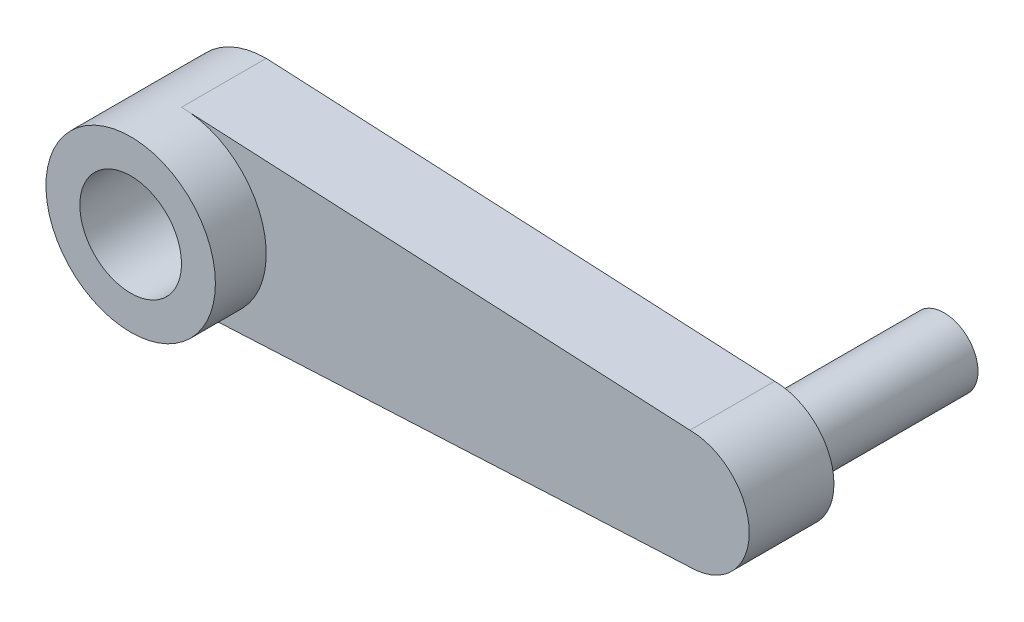
ISO-10303-21;
HEADER;
FILE_DESCRIPTION(('STEP AP214'),'2;1');
FILE_NAME('part.step','',(''),(''),'','','');
FILE_SCHEMA(('AUTOMOTIVE_DESIGN { 1 0 10303 214 1 1 1 1 }'));
ENDSEC;
DATA;
#1=APPLICATION_CONTEXT('core data for automotive mechanical design processes');
#2=APPLICATION_PROTOCOL_DEFINITION('international standard','automotive_design',2000,#1);
#3=PRODUCT_CONTEXT('',#1,'mechanical');
#4=PRODUCT('Part','Part','',(#3));
#5=PRODUCT_RELATED_PRODUCT_CATEGORY('part','',(#4));
#6=PRODUCT_DEFINITION_FORMATION('','',#4);
#7=PRODUCT_DEFINITION_CONTEXT('part definition',#1,'design');
#8=PRODUCT_DEFINITION('design','',#6,#7);
#9=PRODUCT_DEFINITION_SHAPE('','',#8);
#10=(LENGTH_UNIT() NAMED_UNIT(*) SI_UNIT(.MILLI.,.METRE.));
#11=(NAMED_UNIT(*) PLANE_ANGLE_UNIT() SI_UNIT($,.RADIAN.));
#12=(NAMED_UNIT(*) SI_UNIT($,.STERADIAN.) SOLID_ANGLE_UNIT());
#13=UNCERTAINTY_MEASURE_WITH_UNIT(LENGTH_MEASURE(1.E-05),#10,'distance_accuracy_value','');
#14=(GEOMETRIC_REPRESENTATION_CONTEXT(3) GLOBAL_UNCERTAINTY_ASSIGNED_CONTEXT((#13)) GLOBAL_UNIT_ASSIGNED_CONTEXT((#10,
#11,#12)) REPRESENTATION_CONTEXT('',''));
#15=CARTESIAN_POINT('',(0.,0.,0.));
#16=DIRECTION('',(0.,0.,1.));
#17=DIRECTION('',(1.,0.,0.));
#18=AXIS2_PLACEMENT_3D('',#15,#16,#17);
#19=CARTESIAN_POINT('',(0.,0.,2.5));
#20=DIRECTION('',(0.,0.,-1.));
#21=DIRECTION('',(-1.,0.,0.));
#22=AXIS2_PLACEMENT_3D('',#19,#20,#21);
#23=CYLINDRICAL_SURFACE('',#22,5.);
#24=CARTESIAN_POINT('',(0.,0.,-2.5));
#25=DIRECTION('',(0.,0.,1.));
#26=DIRECTION('',(1.,0.,0.));
#27=AXIS2_PLACEMENT_3D('',#24,#25,#26);
#28=CIRCLE('',#27,5.);
#29=CARTESIAN_POINT('',(0.,5.,-2.5));
#30=VERTEX_POINT('',#29);
#31=CARTESIAN_POINT('',(0.,-5.,-2.5));
#32=VERTEX_POINT('',#31);
#33=EDGE_CURVE('E134',#30,#32,#28,.T.);
#34=ORIENTED_EDGE('',*,*,#33,.T.);
#35=DIRECTION('',(0.,0.,-1.));
#36=VECTOR('',#35,1.);
#37=CARTESIAN_POINT('',(0.,-5.,2.5));
#38=LINE('',#37,#36);
#39=CARTESIAN_POINT('',(0.,-5.,2.5));
#40=VERTEX_POINT('',#39);
#41=EDGE_CURVE('E117',#40,#32,#38,.T.);
#42=ORIENTED_EDGE('',*,*,#41,.F.);
#43=CARTESIAN_POINT('',(0.,0.,2.5));
#44=DIRECTION('',(0.,0.,1.));
#45=DIRECTION('',(0.,-1.,0.));
#46=AXIS2_PLACEMENT_3D('',#43,#44,#45);
#47=CIRCLE('',#46,5.);
#48=CARTESIAN_POINT('',(0.498753117206968,-4.97506234413965,2.5));
#49=VERTEX_POINT('',#48);
#50=EDGE_CURVE('E95',#40,#49,#47,.T.);
#51=ORIENTED_EDGE('',*,*,#50,.T.);
#52=CARTESIAN_POINT('',(0.,0.,2.5));
#53=DIRECTION('',(0.,0.,1.));
#54=DIRECTION('',(1.,0.,0.));
#55=AXIS2_PLACEMENT_3D('',#52,#53,#54);
#56=CIRCLE('',#55,5.);
#57=CARTESIAN_POINT('',(0.498753117206968,4.97506234413965,2.5));
#58=VERTEX_POINT('',#57);
#59=EDGE_CURVE('E54',#49,#58,#56,.T.);
#60=ORIENTED_EDGE('',*,*,#59,.T.);
#61=CARTESIAN_POINT('',(0.,5.,2.5));
#62=DIRECTION('',(0.998752338877845,-0.0499376169438929,0.));
#63=VECTOR('',#62,1.);
#64=LINE('',#61,#63);
#65=CARTESIAN_POINT('',(0.,5.,2.5));
#66=VERTEX_POINT('',#65);
#67=EDGE_CURVE('E99',#66,#58,#64,.T.);
#68=ORIENTED_EDGE('',*,*,#67,.F.);
#69=DIRECTION('',(0.,0.,-1.));
#70=VECTOR('',#69,1.);
#71=CARTESIAN_POINT('',(0.,5.,2.5));
#72=LINE('',#71,#70);
#73=EDGE_CURVE('E69',#66,#30,#72,.T.);
#74=ORIENTED_EDGE('',*,*,#73,.T.);
#75=EDGE_LOOP('',(#34,#42,#51,#60,#68,#74));
#76=FACE_BOUND('',#75,.T.);
#77=CARTESIAN_POINT('',(0.,0.,5.5));
#78=DIRECTION('',(0.,0.,1.));
#79=DIRECTION('',(1.,0.,0.));
#80=AXIS2_PLACEMENT_3D('',#77,#78,#79);
#81=CIRCLE('',#80,5.);
#82=CARTESIAN_POINT('',(5.,0.,5.5));
#83=VERTEX_POINT('',#82);
#84=EDGE_CURVE('E130',#83,#83,#81,.T.);
#85=ORIENTED_EDGE('',*,*,#84,.F.);
#86=EDGE_LOOP('',(#85));
#87=FACE_BOUND('',#86,.T.);
#88=ADVANCED_FACE('F45',(#76,#87),#23,.T.);
#89=CARTESIAN_POINT('',(0.,-5.,2.5));
#90=DIRECTION('',(-0.0499376169438922,0.998752338877845,0.));
#91=DIRECTION('',(-0.998752338877845,-0.0499376169438922,0.));
#92=AXIS2_PLACEMENT_3D('',#89,#90,#91);
#93=PLANE('',#92);
#94=DIRECTION('',(0.998752338877845,0.0499376169438922,0.));
#95=VECTOR('',#94,1.);
#96=CARTESIAN_POINT('',(0.,-5.,-2.5));
#97=LINE('',#96,#95);
#98=CARTESIAN_POINT('',(30.,-3.5,-2.5));
#99=VERTEX_POINT('',#98);
#100=EDGE_CURVE('E137',#32,#99,#97,.T.);
#101=ORIENTED_EDGE('',*,*,#100,.T.);
#102=DIRECTION('',(0.,0.,-1.));
#103=VECTOR('',#102,1.);
#104=CARTESIAN_POINT('',(30.,-3.5,2.5));
#105=LINE('',#104,#103);
#106=CARTESIAN_POINT('',(30.,-3.5,2.5));
#107=VERTEX_POINT('',#106);
#108=EDGE_CURVE('E120',#107,#99,#105,.T.);
#109=ORIENTED_EDGE('',*,*,#108,.F.);
#110=DIRECTION('',(0.998752338877845,0.0499376169438922,0.));
#111=VECTOR('',#110,1.);
#112=CARTESIAN_POINT('',(0.,-5.,2.5));
#113=LINE('',#112,#111);
#114=EDGE_CURVE('E148',#49,#107,#113,.T.);
#115=ORIENTED_EDGE('',*,*,#114,.F.);
#116=ORIENTED_EDGE('',*,*,#50,.F.);
#117=ORIENTED_EDGE('',*,*,#41,.T.);
#118=EDGE_LOOP('',(#101,#109,#115,#116,#117));
#119=FACE_BOUND('',#118,.T.);
#120=ADVANCED_FACE('F159',(#119),#93,.F.);
#121=CARTESIAN_POINT('',(30.,0.,2.5));
#122=DIRECTION('',(0.,0.,-1.));
#123=DIRECTION('',(-1.,0.,0.));
#124=AXIS2_PLACEMENT_3D('',#121,#122,#123);
#125=CYLINDRICAL_SURFACE('',#124,3.5);
#126=CARTESIAN_POINT('',(30.,0.,-2.5));
#127=DIRECTION('',(0.,0.,1.));
#128=DIRECTION('',(1.,0.,0.));
#129=AXIS2_PLACEMENT_3D('',#126,#127,#128);
#130=CIRCLE('',#129,3.5);
#131=CARTESIAN_POINT('',(30.,3.5,-2.5));
#132=VERTEX_POINT('',#131);
#133=EDGE_CURVE('E140',#99,#132,#130,.T.);
#134=ORIENTED_EDGE('',*,*,#133,.T.);
#135=DIRECTION('',(0.,0.,-1.));
#136=VECTOR('',#135,1.);
#137=CARTESIAN_POINT('',(30.,3.5,2.5));
#138=LINE('',#137,#136);
#139=CARTESIAN_POINT('',(30.,3.5,2.5));
#140=VERTEX_POINT('',#139);
#141=EDGE_CURVE('E149',#140,#132,#138,.T.);
#142=ORIENTED_EDGE('',*,*,#141,.F.);
#143=CARTESIAN_POINT('',(30.,0.,2.5));
#144=DIRECTION('',(0.,0.,1.));
#145=DIRECTION('',(1.,0.,0.));
#146=AXIS2_PLACEMENT_3D('',#143,#144,#145);
#147=CIRCLE('',#146,3.5);
#148=EDGE_CURVE('E110',#107,#140,#147,.T.);
#149=ORIENTED_EDGE('',*,*,#148,.F.);
#150=ORIENTED_EDGE('',*,*,#108,.T.);
#151=EDGE_LOOP('',(#134,#142,#149,#150));
#152=FACE_BOUND('',#151,.T.);
#153=ADVANCED_FACE('F156',(#152),#125,.T.);
#154=CARTESIAN_POINT('',(0.,5.,2.5));
#155=DIRECTION('',(0.0499376169438922,0.998752338877845,0.));
#156=DIRECTION('',(-0.998752338877845,0.0499376169438922,0.));
#157=AXIS2_PLACEMENT_3D('',#154,#155,#156);
#158=PLANE('',#157);
#159=DIRECTION('',(0.998752338877845,-0.0499376169438922,0.));
#160=VECTOR('',#159,1.);
#161=CARTESIAN_POINT('',(0.,5.,-2.5));
#162=LINE('',#161,#160);
#163=EDGE_CURVE('E144',#30,#132,#162,.T.);
#164=ORIENTED_EDGE('',*,*,#163,.F.);
#165=ORIENTED_EDGE('',*,*,#73,.F.);
#166=ORIENTED_EDGE('',*,*,#67,.T.);
#167=DIRECTION('',(0.998752338877845,-0.0499376169438922,0.));
#168=VECTOR('',#167,1.);
#169=CARTESIAN_POINT('',(0.,5.,2.5));
#170=LINE('',#169,#168);
#171=EDGE_CURVE('E102',#58,#140,#170,.T.);
#172=ORIENTED_EDGE('',*,*,#171,.T.);
#173=ORIENTED_EDGE('',*,*,#141,.T.);
#174=EDGE_LOOP('',(#164,#165,#166,#172,#173));
#175=FACE_BOUND('',#174,.T.);
#176=ADVANCED_FACE('F101',(#175),#158,.T.);
#177=CARTESIAN_POINT('',(0.,0.,2.5));
#178=DIRECTION('',(0.,0.,1.));
#179=DIRECTION('',(1.,0.,0.));
#180=AXIS2_PLACEMENT_3D('',#177,#178,#179);
#181=PLANE('',#180);
#182=ORIENTED_EDGE('',*,*,#59,.F.);
#183=ORIENTED_EDGE('',*,*,#114,.T.);
#184=ORIENTED_EDGE('',*,*,#148,.T.);
#185=ORIENTED_EDGE('',*,*,#171,.F.);
#186=EDGE_LOOP('',(#182,#183,#184,#185));
#187=FACE_BOUND('',#186,.T.);
#188=ADVANCED_FACE('F108',(#187),#181,.T.);
#189=CARTESIAN_POINT('',(0.,0.,-2.5));
#190=DIRECTION('',(0.,0.,1.));
#191=DIRECTION('',(1.,0.,0.));
#192=AXIS2_PLACEMENT_3D('',#189,#190,#191);
#193=PLANE('',#192);
#194=CARTESIAN_POINT('',(0.,0.,-2.5));
#195=DIRECTION('',(0.,0.,1.));
#196=DIRECTION('',(1.,0.,0.));
#197=AXIS2_PLACEMENT_3D('',#194,#195,#196);
#198=CIRCLE('',#197,3.);
#199=CARTESIAN_POINT('',(3.,0.,-2.5));
#200=VERTEX_POINT('',#199);
#201=EDGE_CURVE('E237',#200,#200,#198,.T.);
#202=ORIENTED_EDGE('',*,*,#201,.T.);
#203=EDGE_LOOP('',(#202));
#204=FACE_BOUND('',#203,.T.);
#205=CARTESIAN_POINT('',(30.,0.,-2.5));
#206=DIRECTION('',(0.,0.,1.));
#207=DIRECTION('',(1.,0.,0.));
#208=AXIS2_PLACEMENT_3D('',#205,#206,#207);
#209=CIRCLE('',#208,2.);
#210=CARTESIAN_POINT('',(32.,0.,-2.5));
#211=VERTEX_POINT('',#210);
#212=EDGE_CURVE('E11',#211,#211,#209,.F.);
#213=ORIENTED_EDGE('',*,*,#212,.F.);
#214=EDGE_LOOP('',(#213));
#215=FACE_BOUND('',#214,.T.);
#216=ORIENTED_EDGE('',*,*,#33,.F.);
#217=ORIENTED_EDGE('',*,*,#163,.T.);
#218=ORIENTED_EDGE('',*,*,#133,.F.);
#219=ORIENTED_EDGE('',*,*,#100,.F.);
#220=EDGE_LOOP('',(#216,#217,#218,#219));
#221=FACE_BOUND('',#220,.T.);
#222=ADVANCED_FACE('F158',(#204,#215,#221),#193,.F.);
#223=CARTESIAN_POINT('',(0.,0.,5.5));
#224=DIRECTION('',(0.,0.,1.));
#225=DIRECTION('',(1.,0.,0.));
#226=AXIS2_PLACEMENT_3D('',#223,#224,#225);
#227=PLANE('',#226);
#228=CARTESIAN_POINT('',(0.,0.,5.5));
#229=DIRECTION('',(0.,0.,1.));
#230=DIRECTION('',(1.,0.,0.));
#231=AXIS2_PLACEMENT_3D('',#228,#229,#230);
#232=CIRCLE('',#231,3.);
#233=CARTESIAN_POINT('',(3.,0.,5.5));
#234=VERTEX_POINT('',#233);
#235=EDGE_CURVE('E234',#234,#234,#232,.T.);
#236=ORIENTED_EDGE('',*,*,#235,.F.);
#237=EDGE_LOOP('',(#236));
#238=FACE_BOUND('',#237,.T.);
#239=ORIENTED_EDGE('',*,*,#84,.T.);
#240=EDGE_LOOP('',(#239));
#241=FACE_BOUND('',#240,.T.);
#242=ADVANCED_FACE('F211',(#238,#241),#227,.T.);
#243=CARTESIAN_POINT('',(30.,0.,-12.5));
#244=DIRECTION('',(0.,0.,1.));
#245=DIRECTION('',(1.,0.,0.));
#246=AXIS2_PLACEMENT_3D('',#243,#244,#245);
#247=CYLINDRICAL_SURFACE('',#246,2.);
#248=CARTESIAN_POINT('',(30.,0.,-12.5));
#249=DIRECTION('',(0.,0.,-1.));
#250=DIRECTION('',(-1.,0.,0.));
#251=AXIS2_PLACEMENT_3D('',#248,#249,#250);
#252=CIRCLE('',#251,2.);
#253=CARTESIAN_POINT('',(28.,0.,-12.5));
#254=VERTEX_POINT('',#253);
#255=EDGE_CURVE('E239',#254,#254,#252,.T.);
#256=ORIENTED_EDGE('',*,*,#255,.F.);
#257=EDGE_LOOP('',(#256));
#258=FACE_BOUND('',#257,.T.);
#259=ORIENTED_EDGE('',*,*,#212,.T.);
#260=EDGE_LOOP('',(#259));
#261=FACE_BOUND('',#260,.T.);
#262=ADVANCED_FACE('F217',(#258,#261),#247,.T.);
#263=CARTESIAN_POINT('',(30.,0.,-12.5));
#264=DIRECTION('',(0.,0.,-1.));
#265=DIRECTION('',(-1.,0.,0.));
#266=AXIS2_PLACEMENT_3D('',#263,#264,#265);
#267=PLANE('',#266);
#268=ORIENTED_EDGE('',*,*,#255,.T.);
#269=EDGE_LOOP('',(#268));
#270=FACE_BOUND('',#269,.T.);
#271=ADVANCED_FACE('F221',(#270),#267,.T.);
#272=CARTESIAN_POINT('',(0.,0.,-12.5));
#273=DIRECTION('',(0.,0.,1.));
#274=DIRECTION('',(1.,0.,0.));
#275=AXIS2_PLACEMENT_3D('',#272,#273,#274);
#276=CYLINDRICAL_SURFACE('',#275,3.);
#277=ORIENTED_EDGE('',*,*,#235,.T.);
#278=EDGE_LOOP('',(#277));
#279=FACE_BOUND('',#278,.T.);
#280=ORIENTED_EDGE('',*,*,#201,.F.);
#281=EDGE_LOOP('',(#280));
#282=FACE_BOUND('',#281,.T.);
#283=ADVANCED_FACE('F225',(#279,#282),#276,.F.);
#284=CLOSED_SHELL('',(#88,#120,#153,#176,#188,#222,#242,#262,#271,#283));
#285=MANIFOLD_SOLID_BREP('B2',#284);
#286=ADVANCED_BREP_SHAPE_REPRESENTATION('',(#18,#285),#14);
#287=SHAPE_DEFINITION_REPRESENTATION(#9,#286);
ENDSEC;
END-ISO-10303-21;
